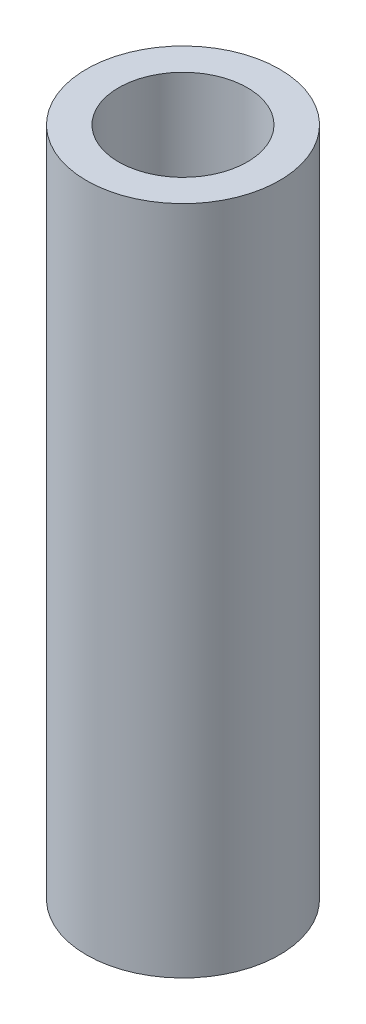
ISO-10303-21;
HEADER;
FILE_DESCRIPTION(('STEP AP214'),'2;1');
FILE_NAME('part.step','',(''),(''),'','','');
FILE_SCHEMA(('AUTOMOTIVE_DESIGN { 1 0 10303 214 1 1 1 1 }'));
ENDSEC;
DATA;
#1=APPLICATION_CONTEXT('core data for automotive mechanical design processes');
#2=APPLICATION_PROTOCOL_DEFINITION('international standard','automotive_design',2000,#1);
#3=PRODUCT_CONTEXT('',#1,'mechanical');
#4=PRODUCT('Part','Part','',(#3));
#5=PRODUCT_RELATED_PRODUCT_CATEGORY('part','',(#4));
#6=PRODUCT_DEFINITION_FORMATION('','',#4);
#7=PRODUCT_DEFINITION_CONTEXT('part definition',#1,'design');
#8=PRODUCT_DEFINITION('design','',#6,#7);
#9=PRODUCT_DEFINITION_SHAPE('','',#8);
#10=(LENGTH_UNIT() NAMED_UNIT(*) SI_UNIT(.MILLI.,.METRE.));
#11=(NAMED_UNIT(*) PLANE_ANGLE_UNIT() SI_UNIT($,.RADIAN.));
#12=(NAMED_UNIT(*) SI_UNIT($,.STERADIAN.) SOLID_ANGLE_UNIT());
#13=UNCERTAINTY_MEASURE_WITH_UNIT(LENGTH_MEASURE(1.E-05),#10,'distance_accuracy_value','');
#14=(GEOMETRIC_REPRESENTATION_CONTEXT(3) GLOBAL_UNCERTAINTY_ASSIGNED_CONTEXT((#13)) GLOBAL_UNIT_ASSIGNED_CONTEXT((#10,
#11,#12)) REPRESENTATION_CONTEXT('',''));
#15=CARTESIAN_POINT('',(0.,0.,0.));
#16=DIRECTION('',(0.,0.,1.));
#17=DIRECTION('',(1.,0.,0.));
#18=AXIS2_PLACEMENT_3D('',#15,#16,#17);
#19=CARTESIAN_POINT('',(0.,41.67,0.));
#20=DIRECTION('',(0.,1.,0.));
#21=DIRECTION('',(0.,0.,1.));
#22=AXIS2_PLACEMENT_3D('',#19,#20,#21);
#23=PLANE('',#22);
#24=CARTESIAN_POINT('',(0.,41.67,0.));
#25=DIRECTION('',(0.,1.,0.));
#26=DIRECTION('',(0.,0.,1.));
#27=AXIS2_PLACEMENT_3D('',#24,#25,#26);
#28=CIRCLE('',#27,6.);
#29=CARTESIAN_POINT('',(0.,41.67,6.));
#30=VERTEX_POINT('',#29);
#31=EDGE_CURVE('E10',#30,#30,#28,.T.);
#32=ORIENTED_EDGE('',*,*,#31,.T.);
#33=EDGE_LOOP('',(#32));
#34=FACE_BOUND('',#33,.T.);
#35=CARTESIAN_POINT('',(0.,41.67,0.));
#36=DIRECTION('',(0.,1.,0.));
#37=DIRECTION('',(0.,0.,1.));
#38=AXIS2_PLACEMENT_3D('',#35,#36,#37);
#39=CIRCLE('',#38,4.);
#40=CARTESIAN_POINT('',(0.,41.67,4.));
#41=VERTEX_POINT('',#40);
#42=EDGE_CURVE('E42',#41,#41,#39,.T.);
#43=ORIENTED_EDGE('',*,*,#42,.F.);
#44=EDGE_LOOP('',(#43));
#45=FACE_BOUND('',#44,.T.);
#46=ADVANCED_FACE('F31',(#34,#45),#23,.T.);
#47=CARTESIAN_POINT('',(0.,0.,0.));
#48=DIRECTION('',(0.,1.,0.));
#49=DIRECTION('',(0.,0.,1.));
#50=AXIS2_PLACEMENT_3D('',#47,#48,#49);
#51=PLANE('',#50);
#52=CARTESIAN_POINT('',(0.,0.,0.));
#53=DIRECTION('',(0.,1.,0.));
#54=DIRECTION('',(0.,0.,1.));
#55=AXIS2_PLACEMENT_3D('',#52,#53,#54);
#56=CIRCLE('',#55,6.);
#57=CARTESIAN_POINT('',(0.,0.,6.));
#58=VERTEX_POINT('',#57);
#59=EDGE_CURVE('E35',#58,#58,#56,.T.);
#60=ORIENTED_EDGE('',*,*,#59,.F.);
#61=EDGE_LOOP('',(#60));
#62=FACE_BOUND('',#61,.T.);
#63=CARTESIAN_POINT('',(0.,0.,0.));
#64=DIRECTION('',(0.,1.,0.));
#65=DIRECTION('',(0.,0.,1.));
#66=AXIS2_PLACEMENT_3D('',#63,#64,#65);
#67=CIRCLE('',#66,4.);
#68=CARTESIAN_POINT('',(0.,0.,4.));
#69=VERTEX_POINT('',#68);
#70=EDGE_CURVE('E44',#69,#69,#67,.T.);
#71=ORIENTED_EDGE('',*,*,#70,.T.);
#72=EDGE_LOOP('',(#71));
#73=FACE_BOUND('',#72,.T.);
#74=ADVANCED_FACE('F54',(#62,#73),#51,.F.);
#75=CARTESIAN_POINT('',(0.,41.67,0.));
#76=DIRECTION('',(0.,-1.,0.));
#77=DIRECTION('',(0.,0.,-1.));
#78=AXIS2_PLACEMENT_3D('',#75,#76,#77);
#79=CYLINDRICAL_SURFACE('',#78,6.);
#80=ORIENTED_EDGE('',*,*,#31,.F.);
#81=EDGE_LOOP('',(#80));
#82=FACE_BOUND('',#81,.T.);
#83=ORIENTED_EDGE('',*,*,#59,.T.);
#84=EDGE_LOOP('',(#83));
#85=FACE_BOUND('',#84,.T.);
#86=ADVANCED_FACE('F33',(#82,#85),#79,.T.);
#87=CARTESIAN_POINT('',(0.,41.67,0.));
#88=DIRECTION('',(0.,-1.,0.));
#89=DIRECTION('',(0.,0.,-1.));
#90=AXIS2_PLACEMENT_3D('',#87,#88,#89);
#91=CYLINDRICAL_SURFACE('',#90,4.);
#92=ORIENTED_EDGE('',*,*,#42,.T.);
#93=EDGE_LOOP('',(#92));
#94=FACE_BOUND('',#93,.T.);
#95=ORIENTED_EDGE('',*,*,#70,.F.);
#96=EDGE_LOOP('',(#95));
#97=FACE_BOUND('',#96,.T.);
#98=ADVANCED_FACE('F50',(#94,#97),#91,.F.);
#99=CLOSED_SHELL('',(#46,#74,#86,#98));
#100=MANIFOLD_SOLID_BREP('B2',#99);
#101=ADVANCED_BREP_SHAPE_REPRESENTATION('',(#18,#100),#14);
#102=SHAPE_DEFINITION_REPRESENTATION(#9,#101);
ENDSEC;
END-ISO-10303-21;
